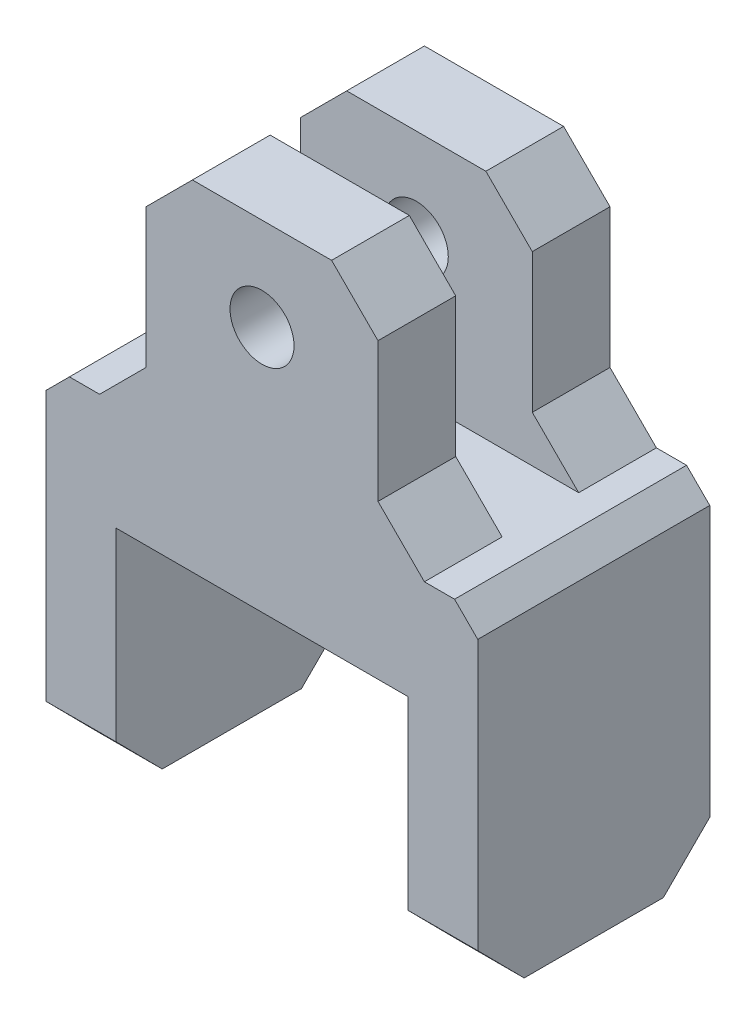
ISO-10303-21;
HEADER;
FILE_DESCRIPTION(('STEP AP214'),'2;1');
FILE_NAME('part.step','',(''),(''),'','','');
FILE_SCHEMA(('AUTOMOTIVE_DESIGN { 1 0 10303 214 1 1 1 1 }'));
ENDSEC;
DATA;
#1=APPLICATION_CONTEXT('core data for automotive mechanical design processes');
#2=APPLICATION_PROTOCOL_DEFINITION('international standard','automotive_design',2000,#1);
#3=PRODUCT_CONTEXT('',#1,'mechanical');
#4=PRODUCT('Part','Part','',(#3));
#5=PRODUCT_RELATED_PRODUCT_CATEGORY('part','',(#4));
#6=PRODUCT_DEFINITION_FORMATION('','',#4);
#7=PRODUCT_DEFINITION_CONTEXT('part definition',#1,'design');
#8=PRODUCT_DEFINITION('design','',#6,#7);
#9=PRODUCT_DEFINITION_SHAPE('','',#8);
#10=(LENGTH_UNIT() NAMED_UNIT(*) SI_UNIT(.MILLI.,.METRE.));
#11=(NAMED_UNIT(*) PLANE_ANGLE_UNIT() SI_UNIT($,.RADIAN.));
#12=(NAMED_UNIT(*) SI_UNIT($,.STERADIAN.) SOLID_ANGLE_UNIT());
#13=UNCERTAINTY_MEASURE_WITH_UNIT(LENGTH_MEASURE(1.E-05),#10,'distance_accuracy_value','');
#14=(GEOMETRIC_REPRESENTATION_CONTEXT(3) GLOBAL_UNCERTAINTY_ASSIGNED_CONTEXT((#13)) GLOBAL_UNIT_ASSIGNED_CONTEXT((#10,
#11,#12)) REPRESENTATION_CONTEXT('',''));
#15=CARTESIAN_POINT('',(0.,0.,0.));
#16=DIRECTION('',(0.,0.,1.));
#17=DIRECTION('',(1.,0.,0.));
#18=AXIS2_PLACEMENT_3D('',#15,#16,#17);
#19=CARTESIAN_POINT('',(29.7555123944606,17.0290580927646,-5.));
#20=DIRECTION('',(-0.707106781186548,0.707106781186548,0.));
#21=DIRECTION('',(-0.707106781186548,-0.707106781186548,0.));
#22=AXIS2_PLACEMENT_3D('',#19,#20,#21);
#23=PLANE('',#22);
#24=DIRECTION('',(0.707106781186548,0.707106781186548,0.));
#25=VECTOR('',#24,1.);
#26=CARTESIAN_POINT('',(29.7555123944606,17.0290580927646,1.65));
#27=LINE('',#26,#25);
#28=CARTESIAN_POINT('',(27.7555120666351,15.0290561351244,1.65));
#29=VERTEX_POINT('',#28);
#30=CARTESIAN_POINT('',(29.7555123944606,17.0290580927646,1.65));
#31=VERTEX_POINT('',#30);
#32=EDGE_CURVE('E447',#29,#31,#27,.T.);
#33=ORIENTED_EDGE('',*,*,#32,.F.);
#34=DIRECTION('',(0.,0.,1.));
#35=VECTOR('',#34,1.);
#36=CARTESIAN_POINT('',(27.7555120666351,15.0290577649391,-5.));
#37=LINE('',#36,#35);
#38=CARTESIAN_POINT('',(27.7555120666351,15.0290577649391,5.));
#39=VERTEX_POINT('',#38);
#40=EDGE_CURVE('E252',#29,#39,#37,.T.);
#41=ORIENTED_EDGE('',*,*,#40,.T.);
#42=DIRECTION('',(-0.707106781186548,-0.707106781186548,0.));
#43=VECTOR('',#42,1.);
#44=CARTESIAN_POINT('',(29.7555123944606,17.0290580927646,5.));
#45=LINE('',#44,#43);
#46=CARTESIAN_POINT('',(29.7555123944606,17.0290580927646,5.));
#47=VERTEX_POINT('',#46);
#48=EDGE_CURVE('E414',#47,#39,#45,.T.);
#49=ORIENTED_EDGE('',*,*,#48,.F.);
#50=DIRECTION('',(0.,0.,1.));
#51=VECTOR('',#50,1.);
#52=CARTESIAN_POINT('',(29.7555123944606,17.0290580927646,-5.));
#53=LINE('',#52,#51);
#54=EDGE_CURVE('E264',#31,#47,#53,.T.);
#55=ORIENTED_EDGE('',*,*,#54,.F.);
#56=EDGE_LOOP('',(#33,#41,#49,#55));
#57=FACE_BOUND('',#56,.T.);
#58=ADVANCED_FACE('F33',(#57),#23,.T.);
#59=CARTESIAN_POINT('',(29.7555123944606,17.0290580927646,-5.));
#60=DIRECTION('',(-1.,0.,0.));
#61=DIRECTION('',(0.,0.,1.));
#62=AXIS2_PLACEMENT_3D('',#59,#60,#61);
#63=PLANE('',#62);
#64=DIRECTION('',(0.,1.,0.));
#65=VECTOR('',#64,1.);
#66=CARTESIAN_POINT('',(29.7555123944606,17.0290580927646,1.65));
#67=LINE('',#66,#65);
#68=CARTESIAN_POINT('',(29.7555123944606,23.0290590762412,1.65));
#69=VERTEX_POINT('',#68);
#70=EDGE_CURVE('E450',#31,#69,#67,.T.);
#71=ORIENTED_EDGE('',*,*,#70,.F.);
#72=ORIENTED_EDGE('',*,*,#54,.T.);
#73=DIRECTION('',(0.,-1.,0.));
#74=VECTOR('',#73,1.);
#75=CARTESIAN_POINT('',(29.7555123944606,17.0290580927646,5.));
#76=LINE('',#75,#74);
#77=CARTESIAN_POINT('',(29.7555123944606,23.0290590762412,5.));
#78=VERTEX_POINT('',#77);
#79=EDGE_CURVE('E368',#78,#47,#76,.T.);
#80=ORIENTED_EDGE('',*,*,#79,.F.);
#81=DIRECTION('',(0.,0.,1.));
#82=VECTOR('',#81,1.);
#83=CARTESIAN_POINT('',(29.7555123944606,23.0290590762412,-5.));
#84=LINE('',#83,#82);
#85=EDGE_CURVE('E274',#69,#78,#84,.T.);
#86=ORIENTED_EDGE('',*,*,#85,.F.);
#87=EDGE_LOOP('',(#71,#72,#80,#86));
#88=FACE_BOUND('',#87,.T.);
#89=ADVANCED_FACE('F501',(#88),#63,.T.);
#90=CARTESIAN_POINT('',(29.7555123944606,23.0290590762412,-5.));
#91=DIRECTION('',(-0.707106534232211,0.707107028140798,0.));
#92=DIRECTION('',(-0.707107028140798,-0.707106534232211,0.));
#93=AXIS2_PLACEMENT_3D('',#90,#91,#92);
#94=PLANE('',#93);
#95=DIRECTION('',(0.707107028140798,0.707106534232211,0.));
#96=VECTOR('',#95,1.);
#97=CARTESIAN_POINT('',(29.7555123944606,23.0290590762412,1.65));
#98=LINE('',#97,#96);
#99=CARTESIAN_POINT('',(31.7555122566249,25.0290575414216,1.65));
#100=VERTEX_POINT('',#99);
#101=EDGE_CURVE('E452',#69,#100,#98,.T.);
#102=ORIENTED_EDGE('',*,*,#101,.F.);
#103=ORIENTED_EDGE('',*,*,#85,.T.);
#104=DIRECTION('',(-0.707107028140798,-0.707106534232211,0.));
#105=VECTOR('',#104,1.);
#106=CARTESIAN_POINT('',(29.7555123944606,23.0290590762412,5.));
#107=LINE('',#106,#105);
#108=CARTESIAN_POINT('',(31.7555122566249,25.0290575414216,5.));
#109=VERTEX_POINT('',#108);
#110=EDGE_CURVE('E365',#109,#78,#107,.T.);
#111=ORIENTED_EDGE('',*,*,#110,.F.);
#112=DIRECTION('',(0.,0.,1.));
#113=VECTOR('',#112,1.);
#114=CARTESIAN_POINT('',(31.7555122566249,25.0290575414216,-5.));
#115=LINE('',#114,#113);
#116=EDGE_CURVE('E278',#100,#109,#115,.T.);
#117=ORIENTED_EDGE('',*,*,#116,.F.);
#118=EDGE_LOOP('',(#102,#103,#111,#117));
#119=FACE_BOUND('',#118,.T.);
#120=ADVANCED_FACE('F505',(#119),#94,.T.);
#121=CARTESIAN_POINT('',(31.7555122566249,25.0290575414216,-5.));
#122=DIRECTION('',(0.,1.,0.));
#123=DIRECTION('',(0.,0.,1.));
#124=AXIS2_PLACEMENT_3D('',#121,#122,#123);
#125=PLANE('',#124);
#126=DIRECTION('',(1.,0.,0.));
#127=VECTOR('',#126,1.);
#128=CARTESIAN_POINT('',(25.4555122484293,25.0290575414216,1.65));
#129=LINE('',#128,#127);
#130=CARTESIAN_POINT('',(37.7555118431177,25.0290575414216,1.65));
#131=VERTEX_POINT('',#130);
#132=EDGE_CURVE('E471',#100,#131,#129,.T.);
#133=ORIENTED_EDGE('',*,*,#132,.F.);
#134=ORIENTED_EDGE('',*,*,#116,.T.);
#135=DIRECTION('',(-1.,0.,0.));
#136=VECTOR('',#135,1.);
#137=CARTESIAN_POINT('',(31.7555122566249,25.0290575414216,5.));
#138=LINE('',#137,#136);
#139=CARTESIAN_POINT('',(37.7555118431177,25.0290575414216,5.));
#140=VERTEX_POINT('',#139);
#141=EDGE_CURVE('E362',#140,#109,#138,.T.);
#142=ORIENTED_EDGE('',*,*,#141,.F.);
#143=DIRECTION('',(0.,0.,1.));
#144=VECTOR('',#143,1.);
#145=CARTESIAN_POINT('',(37.7555118431177,25.0290575414216,-5.));
#146=LINE('',#145,#144);
#147=EDGE_CURVE('E282',#131,#140,#146,.T.);
#148=ORIENTED_EDGE('',*,*,#147,.F.);
#149=EDGE_LOOP('',(#133,#134,#142,#148));
#150=FACE_BOUND('',#149,.T.);
#151=ADVANCED_FACE('F553',(#150),#125,.T.);
#152=CARTESIAN_POINT('',(37.7555118431177,25.0290575414216,-5.));
#153=DIRECTION('',(0.707107028140798,0.707106534232211,0.));
#154=DIRECTION('',(-0.707106534232211,0.707107028140798,0.));
#155=AXIS2_PLACEMENT_3D('',#152,#153,#154);
#156=PLANE('',#155);
#157=DIRECTION('',(0.707106534232211,-0.707107028140798,0.));
#158=VECTOR('',#157,1.);
#159=CARTESIAN_POINT('',(37.7555118431177,25.0290575414216,1.65));
#160=LINE('',#159,#158);
#161=CARTESIAN_POINT('',(39.7555105411287,23.0290574464266,1.65));
#162=VERTEX_POINT('',#161);
#163=EDGE_CURVE('E454',#131,#162,#160,.T.);
#164=ORIENTED_EDGE('',*,*,#163,.F.);
#165=ORIENTED_EDGE('',*,*,#147,.T.);
#166=DIRECTION('',(-0.707106534232211,0.707107028140798,0.));
#167=VECTOR('',#166,1.);
#168=CARTESIAN_POINT('',(37.7555118431177,25.0290575414216,5.));
#169=LINE('',#168,#167);
#170=CARTESIAN_POINT('',(39.7555105411287,23.0290574464266,5.));
#171=VERTEX_POINT('',#170);
#172=EDGE_CURVE('E359',#171,#140,#169,.T.);
#173=ORIENTED_EDGE('',*,*,#172,.F.);
#174=DIRECTION('',(0.,0.,1.));
#175=VECTOR('',#174,1.);
#176=CARTESIAN_POINT('',(39.7555105411287,23.0290574464266,-5.));
#177=LINE('',#176,#175);
#178=EDGE_CURVE('E286',#162,#171,#177,.T.);
#179=ORIENTED_EDGE('',*,*,#178,.F.);
#180=EDGE_LOOP('',(#164,#165,#173,#179));
#181=FACE_BOUND('',#180,.T.);
#182=ADVANCED_FACE('F523',(#181),#156,.T.);
#183=CARTESIAN_POINT('',(39.7555105411287,23.0290574464266,-5.));
#184=DIRECTION('',(1.,0.,0.));
#185=DIRECTION('',(0.,0.,-1.));
#186=AXIS2_PLACEMENT_3D('',#183,#184,#185);
#187=PLANE('',#186);
#188=DIRECTION('',(0.,-1.,0.));
#189=VECTOR('',#188,1.);
#190=CARTESIAN_POINT('',(39.7555105411287,23.0290574464266,1.65));
#191=LINE('',#190,#189);
#192=CARTESIAN_POINT('',(39.7555105411287,17.0290564629499,1.65));
#193=VERTEX_POINT('',#192);
#194=EDGE_CURVE('E456',#162,#193,#191,.T.);
#195=ORIENTED_EDGE('',*,*,#194,.F.);
#196=ORIENTED_EDGE('',*,*,#178,.T.);
#197=DIRECTION('',(0.,1.,0.));
#198=VECTOR('',#197,1.);
#199=CARTESIAN_POINT('',(39.7555105411287,23.0290574464266,5.));
#200=LINE('',#199,#198);
#201=CARTESIAN_POINT('',(39.7555105411287,17.0290564629499,5.));
#202=VERTEX_POINT('',#201);
#203=EDGE_CURVE('E356',#202,#171,#200,.T.);
#204=ORIENTED_EDGE('',*,*,#203,.F.);
#205=DIRECTION('',(0.,0.,1.));
#206=VECTOR('',#205,1.);
#207=CARTESIAN_POINT('',(39.7555105411287,17.0290564629499,-5.));
#208=LINE('',#207,#206);
#209=EDGE_CURVE('E290',#193,#202,#208,.T.);
#210=ORIENTED_EDGE('',*,*,#209,.F.);
#211=EDGE_LOOP('',(#195,#196,#204,#210));
#212=FACE_BOUND('',#211,.T.);
#213=ADVANCED_FACE('F516',(#212),#187,.T.);
#214=CARTESIAN_POINT('',(41.7555108689543,15.0290561351244,-5.));
#215=DIRECTION('',(0.707106781186548,0.707106781186548,0.));
#216=DIRECTION('',(-0.707106781186548,0.707106781186548,0.));
#217=AXIS2_PLACEMENT_3D('',#214,#215,#216);
#218=PLANE('',#217);
#219=DIRECTION('',(0.707106781186548,-0.707106781186548,0.));
#220=VECTOR('',#219,1.);
#221=CARTESIAN_POINT('',(41.7555108689543,15.0290561351244,1.65));
#222=LINE('',#221,#220);
#223=CARTESIAN_POINT('',(41.7555108689543,15.0290561351244,1.65));
#224=VERTEX_POINT('',#223);
#225=EDGE_CURVE('E235',#193,#224,#222,.T.);
#226=ORIENTED_EDGE('',*,*,#225,.F.);
#227=ORIENTED_EDGE('',*,*,#209,.T.);
#228=DIRECTION('',(-0.707106781186548,0.707106781186548,0.));
#229=VECTOR('',#228,1.);
#230=CARTESIAN_POINT('',(41.7555108689543,15.0290561351244,5.));
#231=LINE('',#230,#229);
#232=CARTESIAN_POINT('',(41.7555108689543,15.0290561351244,5.));
#233=VERTEX_POINT('',#232);
#234=EDGE_CURVE('E353',#233,#202,#231,.T.);
#235=ORIENTED_EDGE('',*,*,#234,.F.);
#236=DIRECTION('',(0.,0.,1.));
#237=VECTOR('',#236,1.);
#238=CARTESIAN_POINT('',(41.7555108689543,15.0290561351244,-5.));
#239=LINE('',#238,#237);
#240=EDGE_CURVE('E292',#224,#233,#239,.T.);
#241=ORIENTED_EDGE('',*,*,#240,.F.);
#242=EDGE_LOOP('',(#226,#227,#235,#241));
#243=FACE_BOUND('',#242,.T.);
#244=ADVANCED_FACE('F510',(#243),#218,.T.);
#245=DIRECTION('',(-0.707106781186548,-0.707106781186548,0.));
#246=VECTOR('',#245,1.);
#247=CARTESIAN_POINT('',(29.7555123944606,17.0290580927646,-1.65));
#248=LINE('',#247,#246);
#249=CARTESIAN_POINT('',(29.7555123944606,17.0290580927646,-1.65));
#250=VERTEX_POINT('',#249);
#251=CARTESIAN_POINT('',(27.7555120666351,15.0290561351244,-1.65));
#252=VERTEX_POINT('',#251);
#253=EDGE_CURVE('E228',#250,#252,#248,.T.);
#254=ORIENTED_EDGE('',*,*,#253,.F.);
#255=CARTESIAN_POINT('',(29.7555123944606,17.0290580927646,-5.));
#256=VERTEX_POINT('',#255);
#257=EDGE_CURVE('E260',#256,#250,#53,.T.);
#258=ORIENTED_EDGE('',*,*,#257,.F.);
#259=DIRECTION('',(-0.707106781186548,-0.707106781186548,0.));
#260=VECTOR('',#259,1.);
#261=CARTESIAN_POINT('',(29.7555123944606,17.0290580927646,-5.));
#262=LINE('',#261,#260);
#263=CARTESIAN_POINT('',(27.7555120666351,15.0290577649391,-5.));
#264=VERTEX_POINT('',#263);
#265=EDGE_CURVE('E250',#256,#264,#262,.T.);
#266=ORIENTED_EDGE('',*,*,#265,.T.);
#267=EDGE_CURVE('E241',#264,#252,#37,.T.);
#268=ORIENTED_EDGE('',*,*,#267,.T.);
#269=EDGE_LOOP('',(#254,#258,#266,#268));
#270=FACE_BOUND('',#269,.T.);
#271=ADVANCED_FACE('F35',(#270),#23,.T.);
#272=DIRECTION('',(0.,-1.,0.));
#273=VECTOR('',#272,1.);
#274=CARTESIAN_POINT('',(29.7555123944606,17.0290580927646,-1.65));
#275=LINE('',#274,#273);
#276=CARTESIAN_POINT('',(29.7555123944606,23.0290590762412,-1.65));
#277=VERTEX_POINT('',#276);
#278=EDGE_CURVE('E231',#277,#250,#275,.T.);
#279=ORIENTED_EDGE('',*,*,#278,.F.);
#280=CARTESIAN_POINT('',(29.7555123944606,23.0290590762412,-5.));
#281=VERTEX_POINT('',#280);
#282=EDGE_CURVE('E268',#281,#277,#84,.T.);
#283=ORIENTED_EDGE('',*,*,#282,.F.);
#284=DIRECTION('',(0.,-1.,0.));
#285=VECTOR('',#284,1.);
#286=CARTESIAN_POINT('',(29.7555123944606,17.0290580927646,-5.));
#287=LINE('',#286,#285);
#288=EDGE_CURVE('E256',#281,#256,#287,.T.);
#289=ORIENTED_EDGE('',*,*,#288,.T.);
#290=ORIENTED_EDGE('',*,*,#257,.T.);
#291=EDGE_LOOP('',(#279,#283,#289,#290));
#292=FACE_BOUND('',#291,.T.);
#293=ADVANCED_FACE('F408',(#292),#63,.T.);
#294=DIRECTION('',(-0.707107028140798,-0.707106534232211,0.));
#295=VECTOR('',#294,1.);
#296=CARTESIAN_POINT('',(29.7555123944606,23.0290590762412,-1.65));
#297=LINE('',#296,#295);
#298=CARTESIAN_POINT('',(31.7555122566249,25.0290575414216,-1.65));
#299=VERTEX_POINT('',#298);
#300=EDGE_CURVE('E460',#299,#277,#297,.T.);
#301=ORIENTED_EDGE('',*,*,#300,.F.);
#302=CARTESIAN_POINT('',(31.7555122566249,25.0290575414216,-5.));
#303=VERTEX_POINT('',#302);
#304=EDGE_CURVE('E275',#303,#299,#115,.T.);
#305=ORIENTED_EDGE('',*,*,#304,.F.);
#306=DIRECTION('',(-0.707107028140798,-0.707106534232211,0.));
#307=VECTOR('',#306,1.);
#308=CARTESIAN_POINT('',(29.7555123944606,23.0290590762412,-5.));
#309=LINE('',#308,#307);
#310=EDGE_CURVE('E403',#303,#281,#309,.T.);
#311=ORIENTED_EDGE('',*,*,#310,.T.);
#312=ORIENTED_EDGE('',*,*,#282,.T.);
#313=EDGE_LOOP('',(#301,#305,#311,#312));
#314=FACE_BOUND('',#313,.T.);
#315=ADVANCED_FACE('F515',(#314),#94,.T.);
#316=DIRECTION('',(1.,0.,0.));
#317=VECTOR('',#316,1.);
#318=CARTESIAN_POINT('',(25.4555122484293,25.0290575414216,-1.65));
#319=LINE('',#318,#317);
#320=CARTESIAN_POINT('',(37.7555118431177,25.0290575414216,-1.65));
#321=VERTEX_POINT('',#320);
#322=EDGE_CURVE('E245',#299,#321,#319,.T.);
#323=ORIENTED_EDGE('',*,*,#322,.T.);
#324=CARTESIAN_POINT('',(37.7555118431177,25.0290575414216,-5.));
#325=VERTEX_POINT('',#324);
#326=EDGE_CURVE('E279',#325,#321,#146,.T.);
#327=ORIENTED_EDGE('',*,*,#326,.F.);
#328=DIRECTION('',(-1.,0.,0.));
#329=VECTOR('',#328,1.);
#330=CARTESIAN_POINT('',(31.7555122566249,25.0290575414216,-5.));
#331=LINE('',#330,#329);
#332=EDGE_CURVE('E401',#325,#303,#331,.T.);
#333=ORIENTED_EDGE('',*,*,#332,.T.);
#334=ORIENTED_EDGE('',*,*,#304,.T.);
#335=EDGE_LOOP('',(#323,#327,#333,#334));
#336=FACE_BOUND('',#335,.T.);
#337=ADVANCED_FACE('F545',(#336),#125,.T.);
#338=DIRECTION('',(-0.707106534232211,0.707107028140798,0.));
#339=VECTOR('',#338,1.);
#340=CARTESIAN_POINT('',(37.7555118431177,25.0290575414216,-1.65));
#341=LINE('',#340,#339);
#342=CARTESIAN_POINT('',(39.7555105411287,23.0290574464266,-1.65));
#343=VERTEX_POINT('',#342);
#344=EDGE_CURVE('E462',#343,#321,#341,.T.);
#345=ORIENTED_EDGE('',*,*,#344,.F.);
#346=CARTESIAN_POINT('',(39.7555105411287,23.0290574464266,-5.));
#347=VERTEX_POINT('',#346);
#348=EDGE_CURVE('E283',#347,#343,#177,.T.);
#349=ORIENTED_EDGE('',*,*,#348,.F.);
#350=DIRECTION('',(-0.707106534232211,0.707107028140798,0.));
#351=VECTOR('',#350,1.);
#352=CARTESIAN_POINT('',(37.7555118431177,25.0290575414216,-5.));
#353=LINE('',#352,#351);
#354=EDGE_CURVE('E398',#347,#325,#353,.T.);
#355=ORIENTED_EDGE('',*,*,#354,.T.);
#356=ORIENTED_EDGE('',*,*,#326,.T.);
#357=EDGE_LOOP('',(#345,#349,#355,#356));
#358=FACE_BOUND('',#357,.T.);
#359=ADVANCED_FACE('F536',(#358),#156,.T.);
#360=DIRECTION('',(0.,1.,0.));
#361=VECTOR('',#360,1.);
#362=CARTESIAN_POINT('',(39.7555105411287,23.0290574464266,-1.65));
#363=LINE('',#362,#361);
#364=CARTESIAN_POINT('',(39.7555105411287,17.0290564629499,-1.65));
#365=VERTEX_POINT('',#364);
#366=EDGE_CURVE('E464',#365,#343,#363,.T.);
#367=ORIENTED_EDGE('',*,*,#366,.F.);
#368=CARTESIAN_POINT('',(39.7555105411287,17.0290564629499,-5.));
#369=VERTEX_POINT('',#368);
#370=EDGE_CURVE('E287',#369,#365,#208,.T.);
#371=ORIENTED_EDGE('',*,*,#370,.F.);
#372=DIRECTION('',(0.,1.,0.));
#373=VECTOR('',#372,1.);
#374=CARTESIAN_POINT('',(39.7555105411287,23.0290574464266,-5.));
#375=LINE('',#374,#373);
#376=EDGE_CURVE('E395',#369,#347,#375,.T.);
#377=ORIENTED_EDGE('',*,*,#376,.T.);
#378=ORIENTED_EDGE('',*,*,#348,.T.);
#379=EDGE_LOOP('',(#367,#371,#377,#378));
#380=FACE_BOUND('',#379,.T.);
#381=ADVANCED_FACE('F526',(#380),#187,.T.);
#382=DIRECTION('',(-0.707106781186548,0.707106781186548,0.));
#383=VECTOR('',#382,1.);
#384=CARTESIAN_POINT('',(41.7555108689543,15.0290561351244,-1.65));
#385=LINE('',#384,#383);
#386=CARTESIAN_POINT('',(41.7555108689543,15.0290561351244,-1.65));
#387=VERTEX_POINT('',#386);
#388=EDGE_CURVE('E466',#387,#365,#385,.T.);
#389=ORIENTED_EDGE('',*,*,#388,.F.);
#390=CARTESIAN_POINT('',(41.7555108689543,15.0290561351244,-5.));
#391=VERTEX_POINT('',#390);
#392=EDGE_CURVE('E244',#391,#387,#239,.T.);
#393=ORIENTED_EDGE('',*,*,#392,.F.);
#394=DIRECTION('',(-0.707106781186548,0.707106781186548,0.));
#395=VECTOR('',#394,1.);
#396=CARTESIAN_POINT('',(41.7555108689543,15.0290561351244,-5.));
#397=LINE('',#396,#395);
#398=EDGE_CURVE('E392',#391,#369,#397,.T.);
#399=ORIENTED_EDGE('',*,*,#398,.T.);
#400=ORIENTED_EDGE('',*,*,#370,.T.);
#401=EDGE_LOOP('',(#389,#393,#399,#400));
#402=FACE_BOUND('',#401,.T.);
#403=ADVANCED_FACE('F519',(#402),#218,.T.);
#404=CARTESIAN_POINT('',(43.0555105232473,15.0290561351244,-5.));
#405=DIRECTION('',(0.,1.,0.));
#406=DIRECTION('',(-1.,0.,0.));
#407=AXIS2_PLACEMENT_3D('',#404,#405,#406);
#408=PLANE('',#407);
#409=ORIENTED_EDGE('',*,*,#392,.T.);
#410=DIRECTION('',(1.,0.,0.));
#411=VECTOR('',#410,1.);
#412=CARTESIAN_POINT('',(25.4555122484293,15.0290561351244,-1.65));
#413=LINE('',#412,#411);
#414=EDGE_CURVE('E49',#252,#387,#413,.T.);
#415=ORIENTED_EDGE('',*,*,#414,.F.);
#416=ORIENTED_EDGE('',*,*,#267,.F.);
#417=DIRECTION('',(-1.,0.,0.));
#418=VECTOR('',#417,1.);
#419=CARTESIAN_POINT('',(27.7555120666351,15.0290577649391,-5.));
#420=LINE('',#419,#418);
#421=CARTESIAN_POINT('',(26.455512412342,15.0290577649391,-5.));
#422=VERTEX_POINT('',#421);
#423=EDGE_CURVE('E372',#264,#422,#420,.T.);
#424=ORIENTED_EDGE('',*,*,#423,.T.);
#425=DIRECTION('',(0.,0.,1.));
#426=VECTOR('',#425,1.);
#427=CARTESIAN_POINT('',(26.455512412342,15.0290577649391,-5.));
#428=LINE('',#427,#426);
#429=CARTESIAN_POINT('',(26.455512412342,15.0290577649391,5.));
#430=VERTEX_POINT('',#429);
#431=EDGE_CURVE('E251',#422,#430,#428,.T.);
#432=ORIENTED_EDGE('',*,*,#431,.T.);
#433=DIRECTION('',(-1.,0.,0.));
#434=VECTOR('',#433,1.);
#435=CARTESIAN_POINT('',(27.7555120666351,15.0290577649391,5.));
#436=LINE('',#435,#434);
#437=EDGE_CURVE('E329',#39,#430,#436,.T.);
#438=ORIENTED_EDGE('',*,*,#437,.F.);
#439=ORIENTED_EDGE('',*,*,#40,.F.);
#440=DIRECTION('',(1.,0.,0.));
#441=VECTOR('',#440,1.);
#442=CARTESIAN_POINT('',(25.4555122484293,15.0290561351244,1.65));
#443=LINE('',#442,#441);
#444=EDGE_CURVE('E467',#29,#224,#443,.T.);
#445=ORIENTED_EDGE('',*,*,#444,.T.);
#446=ORIENTED_EDGE('',*,*,#240,.T.);
#447=DIRECTION('',(-1.,0.,0.));
#448=VECTOR('',#447,1.);
#449=CARTESIAN_POINT('',(43.0555105232473,15.0290561351244,5.));
#450=LINE('',#449,#448);
#451=CARTESIAN_POINT('',(43.0555105232473,15.0290561351244,5.));
#452=VERTEX_POINT('',#451);
#453=EDGE_CURVE('E350',#452,#233,#450,.T.);
#454=ORIENTED_EDGE('',*,*,#453,.F.);
#455=DIRECTION('',(0.,0.,1.));
#456=VECTOR('',#455,1.);
#457=CARTESIAN_POINT('',(43.0555105232473,15.0290561351244,-5.));
#458=LINE('',#457,#456);
#459=CARTESIAN_POINT('',(43.0555105232473,15.0290561351244,-5.));
#460=VERTEX_POINT('',#459);
#461=EDGE_CURVE('E293',#460,#452,#458,.T.);
#462=ORIENTED_EDGE('',*,*,#461,.F.);
#463=DIRECTION('',(-1.,0.,0.));
#464=VECTOR('',#463,1.);
#465=CARTESIAN_POINT('',(43.0555105232473,15.0290561351244,-5.));
#466=LINE('',#465,#464);
#467=EDGE_CURVE('E390',#460,#391,#466,.T.);
#468=ORIENTED_EDGE('',*,*,#467,.T.);
#469=EDGE_LOOP('',(#409,#415,#416,#424,#432,#438,#439,#445,#446,#454,#462,#468));
#470=FACE_BOUND('',#469,.T.);
#471=ADVANCED_FACE('F239',(#470),#408,.T.);
#472=CARTESIAN_POINT('',(44.0555106871601,14.0290559712116,-5.));
#473=DIRECTION('',(0.707106781186548,0.707106781186548,0.));
#474=DIRECTION('',(-0.707106781186548,0.707106781186548,0.));
#475=AXIS2_PLACEMENT_3D('',#472,#473,#474);
#476=PLANE('',#475);
#477=ORIENTED_EDGE('',*,*,#461,.T.);
#478=DIRECTION('',(-0.707106781186548,0.707106781186548,0.));
#479=VECTOR('',#478,1.);
#480=CARTESIAN_POINT('',(44.0555106871601,14.0290559712116,5.));
#481=LINE('',#480,#479);
#482=CARTESIAN_POINT('',(44.0555106871601,14.0290559712116,5.));
#483=VERTEX_POINT('',#482);
#484=EDGE_CURVE('E347',#483,#452,#481,.T.);
#485=ORIENTED_EDGE('',*,*,#484,.F.);
#486=DIRECTION('',(0.,0.,1.));
#487=VECTOR('',#486,1.);
#488=CARTESIAN_POINT('',(44.0555106871601,14.0290559712116,-5.));
#489=LINE('',#488,#487);
#490=CARTESIAN_POINT('',(44.0555106871601,14.0290559712116,-5.));
#491=VERTEX_POINT('',#490);
#492=EDGE_CURVE('E295',#491,#483,#489,.T.);
#493=ORIENTED_EDGE('',*,*,#492,.F.);
#494=DIRECTION('',(-0.707106781186548,0.707106781186548,0.));
#495=VECTOR('',#494,1.);
#496=CARTESIAN_POINT('',(44.0555106871601,14.0290559712116,-5.));
#497=LINE('',#496,#495);
#498=EDGE_CURVE('E387',#491,#460,#497,.T.);
#499=ORIENTED_EDGE('',*,*,#498,.T.);
#500=EDGE_LOOP('',(#477,#485,#493,#499));
#501=FACE_BOUND('',#500,.T.);
#502=ADVANCED_FACE('F535',(#501),#476,.T.);
#503=CARTESIAN_POINT('',(44.0555106871601,0.389058047465075,-5.));
#504=DIRECTION('',(1.,0.,0.));
#505=DIRECTION('',(0.,0.,-1.));
#506=AXIS2_PLACEMENT_3D('',#503,#504,#505);
#507=PLANE('',#506);
#508=DIRECTION('',(0.,-0.707106781186548,0.707106781186548));
#509=VECTOR('',#508,1.);
#510=CARTESIAN_POINT('',(44.0555106871601,2.38905804746507,-5.));
#511=LINE('',#510,#509);
#512=CARTESIAN_POINT('',(44.0555106871601,2.38905804746507,-5.));
#513=VERTEX_POINT('',#512);
#514=CARTESIAN_POINT('',(44.0555106871601,0.389058047465075,-3.));
#515=VERTEX_POINT('',#514);
#516=EDGE_CURVE('E445',#513,#515,#511,.T.);
#517=ORIENTED_EDGE('',*,*,#516,.F.);
#518=DIRECTION('',(0.,1.,0.));
#519=VECTOR('',#518,1.);
#520=CARTESIAN_POINT('',(44.0555106871601,0.389058047465075,-5.));
#521=LINE('',#520,#519);
#522=EDGE_CURVE('E385',#513,#491,#521,.T.);
#523=ORIENTED_EDGE('',*,*,#522,.T.);
#524=ORIENTED_EDGE('',*,*,#492,.T.);
#525=DIRECTION('',(0.,1.,0.));
#526=VECTOR('',#525,1.);
#527=CARTESIAN_POINT('',(44.0555106871601,0.389058047465075,5.));
#528=LINE('',#527,#526);
#529=CARTESIAN_POINT('',(44.0555106871601,2.41080829765876,5.));
#530=VERTEX_POINT('',#529);
#531=EDGE_CURVE('E345',#530,#483,#528,.T.);
#532=ORIENTED_EDGE('',*,*,#531,.F.);
#533=DIRECTION('',(0.,0.710920528041965,0.70327235322351));
#534=VECTOR('',#533,1.);
#535=CARTESIAN_POINT('',(44.0555106871601,2.41080829765876,5.));
#536=LINE('',#535,#534);
#537=CARTESIAN_POINT('',(44.0555106871601,0.389058047465075,3.));
#538=VERTEX_POINT('',#537);
#539=EDGE_CURVE('E432',#538,#530,#536,.T.);
#540=ORIENTED_EDGE('',*,*,#539,.F.);
#541=DIRECTION('',(0.,0.,1.));
#542=VECTOR('',#541,1.);
#543=CARTESIAN_POINT('',(44.0555106871601,0.389058047465075,-5.));
#544=LINE('',#543,#542);
#545=EDGE_CURVE('E298',#515,#538,#544,.T.);
#546=ORIENTED_EDGE('',*,*,#545,.F.);
#547=EDGE_LOOP('',(#517,#523,#524,#532,#540,#546));
#548=FACE_BOUND('',#547,.T.);
#549=ADVANCED_FACE('F614',(#548),#507,.T.);
#550=CARTESIAN_POINT('',(41.0555118252363,0.389058047465075,-5.));
#551=DIRECTION('',(0.,-1.,0.));
#552=DIRECTION('',(0.,0.,-1.));
#553=AXIS2_PLACEMENT_3D('',#550,#551,#552);
#554=PLANE('',#553);
#555=DIRECTION('',(1.,0.,0.));
#556=VECTOR('',#555,1.);
#557=CARTESIAN_POINT('',(25.4555122484293,0.389058047465075,-3.));
#558=LINE('',#557,#556);
#559=CARTESIAN_POINT('',(41.0555118252363,0.389058047465075,-3.));
#560=VERTEX_POINT('',#559);
#561=EDGE_CURVE('E442',#560,#515,#558,.T.);
#562=ORIENTED_EDGE('',*,*,#561,.T.);
#563=ORIENTED_EDGE('',*,*,#545,.T.);
#564=DIRECTION('',(1.,0.,0.));
#565=VECTOR('',#564,1.);
#566=CARTESIAN_POINT('',(25.4555122484293,0.389058047465075,3.));
#567=LINE('',#566,#565);
#568=CARTESIAN_POINT('',(41.0555118252363,0.389058047465075,3.));
#569=VERTEX_POINT('',#568);
#570=EDGE_CURVE('E430',#569,#538,#567,.T.);
#571=ORIENTED_EDGE('',*,*,#570,.F.);
#572=DIRECTION('',(0.,0.,1.));
#573=VECTOR('',#572,1.);
#574=CARTESIAN_POINT('',(41.0555118252363,0.389058047465075,-5.));
#575=LINE('',#574,#573);
#576=EDGE_CURVE('E300',#560,#569,#575,.T.);
#577=ORIENTED_EDGE('',*,*,#576,.F.);
#578=EDGE_LOOP('',(#562,#563,#571,#577));
#579=FACE_BOUND('',#578,.T.);
#580=ADVANCED_FACE('F746',(#579),#554,.T.);
#581=CARTESIAN_POINT('',(41.0555118252363,10.3890578239477,-5.));
#582=DIRECTION('',(-1.,0.,0.));
#583=DIRECTION('',(0.,0.,1.));
#584=AXIS2_PLACEMENT_3D('',#581,#582,#583);
#585=PLANE('',#584);
#586=DIRECTION('',(0.,0.707106781186548,-0.707106781186548));
#587=VECTOR('',#586,1.);
#588=CARTESIAN_POINT('',(41.0555118252363,6.38905793570637,-8.99999988824129));
#589=LINE('',#588,#587);
#590=CARTESIAN_POINT('',(41.0555118252363,2.38905804746507,-5.));
#591=VERTEX_POINT('',#590);
#592=EDGE_CURVE('E434',#560,#591,#589,.T.);
#593=ORIENTED_EDGE('',*,*,#592,.F.);
#594=ORIENTED_EDGE('',*,*,#576,.T.);
#595=DIRECTION('',(0.,-0.710920528041965,-0.70327235322351));
#596=VECTOR('',#595,1.);
#597=CARTESIAN_POINT('',(41.0555118252363,1.44337188472446,4.04297139288929));
#598=LINE('',#597,#596);
#599=CARTESIAN_POINT('',(41.0555118252363,2.41080829765876,5.));
#600=VERTEX_POINT('',#599);
#601=EDGE_CURVE('E419',#600,#569,#598,.T.);
#602=ORIENTED_EDGE('',*,*,#601,.F.);
#603=DIRECTION('',(0.,-1.,0.));
#604=VECTOR('',#603,1.);
#605=CARTESIAN_POINT('',(41.0555118252363,10.3890578239477,5.));
#606=LINE('',#605,#604);
#607=CARTESIAN_POINT('',(41.0555118252363,10.3890578239477,5.));
#608=VERTEX_POINT('',#607);
#609=EDGE_CURVE('E343',#608,#600,#606,.T.);
#610=ORIENTED_EDGE('',*,*,#609,.F.);
#611=DIRECTION('',(0.,0.,1.));
#612=VECTOR('',#611,1.);
#613=CARTESIAN_POINT('',(41.0555118252363,10.3890578239477,-5.));
#614=LINE('',#613,#612);
#615=CARTESIAN_POINT('',(41.0555118252363,10.3890578239477,-5.));
#616=VERTEX_POINT('',#615);
#617=EDGE_CURVE('E302',#616,#608,#614,.T.);
#618=ORIENTED_EDGE('',*,*,#617,.F.);
#619=DIRECTION('',(0.,-1.,0.));
#620=VECTOR('',#619,1.);
#621=CARTESIAN_POINT('',(41.0555118252363,10.3890578239477,-5.));
#622=LINE('',#621,#620);
#623=EDGE_CURVE('E382',#616,#591,#622,.T.);
#624=ORIENTED_EDGE('',*,*,#623,.T.);
#625=EDGE_LOOP('',(#593,#594,#602,#610,#618,#624));
#626=FACE_BOUND('',#625,.T.);
#627=ADVANCED_FACE('F709',(#626),#585,.T.);
#628=CARTESIAN_POINT('',(28.4555122745063,10.3890578239477,-5.));
#629=DIRECTION('',(0.,-1.,0.));
#630=DIRECTION('',(0.,0.,-1.));
#631=AXIS2_PLACEMENT_3D('',#628,#629,#630);
#632=PLANE('',#631);
#633=ORIENTED_EDGE('',*,*,#617,.T.);
#634=DIRECTION('',(1.,0.,0.));
#635=VECTOR('',#634,1.);
#636=CARTESIAN_POINT('',(28.4555122745063,10.3890578239477,5.));
#637=LINE('',#636,#635);
#638=CARTESIAN_POINT('',(28.4555122745063,10.3890578239477,5.));
#639=VERTEX_POINT('',#638);
#640=EDGE_CURVE('E337',#639,#608,#637,.T.);
#641=ORIENTED_EDGE('',*,*,#640,.F.);
#642=DIRECTION('',(0.,0.,1.));
#643=VECTOR('',#642,1.);
#644=CARTESIAN_POINT('',(28.4555122745063,10.3890578239477,-5.));
#645=LINE('',#644,#643);
#646=CARTESIAN_POINT('',(28.4555122745063,10.3890578239477,-5.));
#647=VERTEX_POINT('',#646);
#648=EDGE_CURVE('E304',#647,#639,#645,.T.);
#649=ORIENTED_EDGE('',*,*,#648,.F.);
#650=DIRECTION('',(1.,0.,0.));
#651=VECTOR('',#650,1.);
#652=CARTESIAN_POINT('',(28.4555122745063,10.3890578239477,-5.));
#653=LINE('',#652,#651);
#654=EDGE_CURVE('E379',#647,#616,#653,.T.);
#655=ORIENTED_EDGE('',*,*,#654,.T.);
#656=EDGE_LOOP('',(#633,#641,#649,#655));
#657=FACE_BOUND('',#656,.T.);
#658=ADVANCED_FACE('F704',(#657),#632,.T.);
#659=CARTESIAN_POINT('',(28.4555122745063,0.389058047465075,-5.));
#660=DIRECTION('',(1.,0.,0.));
#661=DIRECTION('',(0.,0.,-1.));
#662=AXIS2_PLACEMENT_3D('',#659,#660,#661);
#663=PLANE('',#662);
#664=DIRECTION('',(0.,-0.707106781186548,0.707106781186548));
#665=VECTOR('',#664,1.);
#666=CARTESIAN_POINT('',(28.4555122745063,1.38905804746507,-4.));
#667=LINE('',#666,#665);
#668=CARTESIAN_POINT('',(28.4555122745063,2.38905804746507,-5.));
#669=VERTEX_POINT('',#668);
#670=CARTESIAN_POINT('',(28.4555122745063,0.389058047465075,-3.));
#671=VERTEX_POINT('',#670);
#672=EDGE_CURVE('E437',#669,#671,#667,.T.);
#673=ORIENTED_EDGE('',*,*,#672,.F.);
#674=DIRECTION('',(0.,1.,0.));
#675=VECTOR('',#674,1.);
#676=CARTESIAN_POINT('',(28.4555122745063,0.389058047465075,-5.));
#677=LINE('',#676,#675);
#678=EDGE_CURVE('E377',#669,#647,#677,.T.);
#679=ORIENTED_EDGE('',*,*,#678,.T.);
#680=ORIENTED_EDGE('',*,*,#648,.T.);
#681=DIRECTION('',(0.,1.,0.));
#682=VECTOR('',#681,1.);
#683=CARTESIAN_POINT('',(28.4555122745063,0.389058047465075,5.));
#684=LINE('',#683,#682);
#685=CARTESIAN_POINT('',(28.4555122745063,2.41080829765876,5.));
#686=VERTEX_POINT('',#685);
#687=EDGE_CURVE('E335',#686,#639,#684,.T.);
#688=ORIENTED_EDGE('',*,*,#687,.F.);
#689=DIRECTION('',(0.,0.710920528041965,0.70327235322351));
#690=VECTOR('',#689,1.);
#691=CARTESIAN_POINT('',(28.4555122745063,-3.61070797422271,-0.956736022468268));
#692=LINE('',#691,#690);
#693=CARTESIAN_POINT('',(28.4555122745063,0.389058047465075,3.));
#694=VERTEX_POINT('',#693);
#695=EDGE_CURVE('E422',#694,#686,#692,.T.);
#696=ORIENTED_EDGE('',*,*,#695,.F.);
#697=DIRECTION('',(0.,0.,1.));
#698=VECTOR('',#697,1.);
#699=CARTESIAN_POINT('',(28.4555122745063,0.389058047465075,-5.));
#700=LINE('',#699,#698);
#701=EDGE_CURVE('E307',#671,#694,#700,.T.);
#702=ORIENTED_EDGE('',*,*,#701,.F.);
#703=EDGE_LOOP('',(#673,#679,#680,#688,#696,#702));
#704=FACE_BOUND('',#703,.T.);
#705=ADVANCED_FACE('F708',(#704),#663,.T.);
#706=CARTESIAN_POINT('',(25.4555122484293,0.389058047465075,-5.));
#707=DIRECTION('',(0.,-1.,0.));
#708=DIRECTION('',(0.,0.,-1.));
#709=AXIS2_PLACEMENT_3D('',#706,#707,#708);
#710=PLANE('',#709);
#711=CARTESIAN_POINT('',(25.4555122484293,0.389058047465075,-3.));
#712=VERTEX_POINT('',#711);
#713=EDGE_CURVE('E439',#712,#671,#558,.T.);
#714=ORIENTED_EDGE('',*,*,#713,.T.);
#715=ORIENTED_EDGE('',*,*,#701,.T.);
#716=CARTESIAN_POINT('',(25.4555122484293,0.389058047465075,3.));
#717=VERTEX_POINT('',#716);
#718=EDGE_CURVE('E427',#717,#694,#567,.T.);
#719=ORIENTED_EDGE('',*,*,#718,.F.);
#720=DIRECTION('',(0.,0.,1.));
#721=VECTOR('',#720,1.);
#722=CARTESIAN_POINT('',(25.4555122484293,0.389058047465075,-5.));
#723=LINE('',#722,#721);
#724=EDGE_CURVE('E309',#712,#717,#723,.T.);
#725=ORIENTED_EDGE('',*,*,#724,.F.);
#726=EDGE_LOOP('',(#714,#715,#719,#725));
#727=FACE_BOUND('',#726,.T.);
#728=ADVANCED_FACE('F725',(#727),#710,.T.);
#729=CARTESIAN_POINT('',(25.4555122484293,14.0290576010263,-5.));
#730=DIRECTION('',(-1.,0.,0.));
#731=DIRECTION('',(0.,0.,1.));
#732=AXIS2_PLACEMENT_3D('',#729,#730,#731);
#733=PLANE('',#732);
#734=DIRECTION('',(0.,-0.707106781186548,0.707106781186548));
#735=VECTOR('',#734,1.);
#736=CARTESIAN_POINT('',(25.4555122484293,2.38905804746507,-5.));
#737=LINE('',#736,#735);
#738=CARTESIAN_POINT('',(25.4555122484293,2.38905804746507,-5.));
#739=VERTEX_POINT('',#738);
#740=EDGE_CURVE('E57',#739,#712,#737,.T.);
#741=ORIENTED_EDGE('',*,*,#740,.T.);
#742=ORIENTED_EDGE('',*,*,#724,.T.);
#743=DIRECTION('',(0.,0.710920528041965,0.70327235322351));
#744=VECTOR('',#743,1.);
#745=CARTESIAN_POINT('',(25.4555122484293,2.41080829765876,5.));
#746=LINE('',#745,#744);
#747=CARTESIAN_POINT('',(25.4555122484293,2.41080829765876,5.));
#748=VERTEX_POINT('',#747);
#749=EDGE_CURVE('E334',#717,#748,#746,.T.);
#750=ORIENTED_EDGE('',*,*,#749,.T.);
#751=DIRECTION('',(0.,-1.,0.));
#752=VECTOR('',#751,1.);
#753=CARTESIAN_POINT('',(25.4555122484293,14.0290576010263,5.));
#754=LINE('',#753,#752);
#755=CARTESIAN_POINT('',(25.4555122484293,14.0290576010263,5.));
#756=VERTEX_POINT('',#755);
#757=EDGE_CURVE('E326',#756,#748,#754,.T.);
#758=ORIENTED_EDGE('',*,*,#757,.F.);
#759=DIRECTION('',(0.,0.,1.));
#760=VECTOR('',#759,1.);
#761=CARTESIAN_POINT('',(25.4555122484293,14.0290576010263,-5.));
#762=LINE('',#761,#760);
#763=CARTESIAN_POINT('',(25.4555122484293,14.0290576010263,-5.));
#764=VERTEX_POINT('',#763);
#765=EDGE_CURVE('E254',#764,#756,#762,.T.);
#766=ORIENTED_EDGE('',*,*,#765,.F.);
#767=DIRECTION('',(0.,-1.,0.));
#768=VECTOR('',#767,1.);
#769=CARTESIAN_POINT('',(25.4555122484293,14.0290576010263,-5.));
#770=LINE('',#769,#768);
#771=EDGE_CURVE('E375',#764,#739,#770,.T.);
#772=ORIENTED_EDGE('',*,*,#771,.T.);
#773=EDGE_LOOP('',(#741,#742,#750,#758,#766,#772));
#774=FACE_BOUND('',#773,.T.);
#775=ADVANCED_FACE('F332',(#774),#733,.T.);
#776=CARTESIAN_POINT('',(26.455512412342,15.0290577649391,-5.));
#777=DIRECTION('',(-0.707106781186548,0.707106781186548,0.));
#778=DIRECTION('',(-0.707106781186548,-0.707106781186548,0.));
#779=AXIS2_PLACEMENT_3D('',#776,#777,#778);
#780=PLANE('',#779);
#781=ORIENTED_EDGE('',*,*,#765,.T.);
#782=DIRECTION('',(-0.707106781186548,-0.707106781186548,0.));
#783=VECTOR('',#782,1.);
#784=CARTESIAN_POINT('',(26.455512412342,15.0290577649391,5.));
#785=LINE('',#784,#783);
#786=EDGE_CURVE('E315',#430,#756,#785,.T.);
#787=ORIENTED_EDGE('',*,*,#786,.F.);
#788=ORIENTED_EDGE('',*,*,#431,.F.);
#789=DIRECTION('',(-0.707106781186548,-0.707106781186548,0.));
#790=VECTOR('',#789,1.);
#791=CARTESIAN_POINT('',(26.455512412342,15.0290577649391,-5.));
#792=LINE('',#791,#790);
#793=EDGE_CURVE('E317',#422,#764,#792,.T.);
#794=ORIENTED_EDGE('',*,*,#793,.T.);
#795=EDGE_LOOP('',(#781,#787,#788,#794));
#796=FACE_BOUND('',#795,.T.);
#797=ADVANCED_FACE('F314',(#796),#780,.T.);
#798=CARTESIAN_POINT('',(0.,0.,-5.));
#799=DIRECTION('',(0.,0.,-1.));
#800=DIRECTION('',(-1.,0.,0.));
#801=AXIS2_PLACEMENT_3D('',#798,#799,#800);
#802=PLANE('',#801);
#803=CARTESIAN_POINT('',(34.7555120498713,21.0290575414216,-5.));
#804=DIRECTION('',(0.,0.,1.));
#805=DIRECTION('',(1.,0.,0.));
#806=AXIS2_PLACEMENT_3D('',#803,#804,#805);
#807=CIRCLE('',#806,1.38);
#808=CARTESIAN_POINT('',(36.1355120498713,21.0290575414216,-5.));
#809=VERTEX_POINT('',#808);
#810=EDGE_CURVE('E479',#809,#809,#807,.T.);
#811=ORIENTED_EDGE('',*,*,#810,.T.);
#812=EDGE_LOOP('',(#811));
#813=FACE_BOUND('',#812,.T.);
#814=DIRECTION('',(1.,0.,0.));
#815=VECTOR('',#814,1.);
#816=CARTESIAN_POINT('',(25.4555122484293,2.38905804746507,-5.));
#817=LINE('',#816,#815);
#818=EDGE_CURVE('E440',#739,#669,#817,.T.);
#819=ORIENTED_EDGE('',*,*,#818,.F.);
#820=ORIENTED_EDGE('',*,*,#771,.F.);
#821=ORIENTED_EDGE('',*,*,#793,.F.);
#822=ORIENTED_EDGE('',*,*,#423,.F.);
#823=ORIENTED_EDGE('',*,*,#265,.F.);
#824=ORIENTED_EDGE('',*,*,#288,.F.);
#825=ORIENTED_EDGE('',*,*,#310,.F.);
#826=ORIENTED_EDGE('',*,*,#332,.F.);
#827=ORIENTED_EDGE('',*,*,#354,.F.);
#828=ORIENTED_EDGE('',*,*,#376,.F.);
#829=ORIENTED_EDGE('',*,*,#398,.F.);
#830=ORIENTED_EDGE('',*,*,#467,.F.);
#831=ORIENTED_EDGE('',*,*,#498,.F.);
#832=ORIENTED_EDGE('',*,*,#522,.F.);
#833=DIRECTION('',(1.,0.,0.));
#834=VECTOR('',#833,1.);
#835=CARTESIAN_POINT('',(0.,2.38905804746507,-5.));
#836=LINE('',#835,#834);
#837=EDGE_CURVE('E11',#591,#513,#836,.T.);
#838=ORIENTED_EDGE('',*,*,#837,.F.);
#839=ORIENTED_EDGE('',*,*,#623,.F.);
#840=ORIENTED_EDGE('',*,*,#654,.F.);
#841=ORIENTED_EDGE('',*,*,#678,.F.);
#842=EDGE_LOOP('',(#819,#820,#821,#822,#823,#824,#825,#826,#827,#828,#829,#830,#831,#832,#838,
#839,#840,#841));
#843=FACE_BOUND('',#842,.T.);
#844=ADVANCED_FACE('F410',(#813,#843),#802,.T.);
#845=CARTESIAN_POINT('',(0.,0.,5.));
#846=DIRECTION('',(0.,0.,-1.));
#847=DIRECTION('',(-1.,0.,0.));
#848=AXIS2_PLACEMENT_3D('',#845,#846,#847);
#849=PLANE('',#848);
#850=CARTESIAN_POINT('',(34.7555120498713,21.0290575414216,5.));
#851=DIRECTION('',(0.,0.,1.));
#852=DIRECTION('',(1.,0.,0.));
#853=AXIS2_PLACEMENT_3D('',#850,#851,#852);
#854=CIRCLE('',#853,1.38);
#855=CARTESIAN_POINT('',(36.1355120498713,21.0290575414216,5.));
#856=VERTEX_POINT('',#855);
#857=EDGE_CURVE('E476',#856,#856,#854,.T.);
#858=ORIENTED_EDGE('',*,*,#857,.F.);
#859=EDGE_LOOP('',(#858));
#860=FACE_BOUND('',#859,.T.);
#861=ORIENTED_EDGE('',*,*,#757,.T.);
#862=DIRECTION('',(1.,0.,0.));
#863=VECTOR('',#862,1.);
#864=CARTESIAN_POINT('',(25.4555122484293,2.41080829765876,5.));
#865=LINE('',#864,#863);
#866=EDGE_CURVE('E426',#748,#686,#865,.T.);
#867=ORIENTED_EDGE('',*,*,#866,.T.);
#868=ORIENTED_EDGE('',*,*,#687,.T.);
#869=ORIENTED_EDGE('',*,*,#640,.T.);
#870=ORIENTED_EDGE('',*,*,#609,.T.);
#871=DIRECTION('',(1.,0.,0.));
#872=VECTOR('',#871,1.);
#873=CARTESIAN_POINT('',(0.,2.41080829765876,5.));
#874=LINE('',#873,#872);
#875=EDGE_CURVE('E42',#600,#530,#874,.T.);
#876=ORIENTED_EDGE('',*,*,#875,.T.);
#877=ORIENTED_EDGE('',*,*,#531,.T.);
#878=ORIENTED_EDGE('',*,*,#484,.T.);
#879=ORIENTED_EDGE('',*,*,#453,.T.);
#880=ORIENTED_EDGE('',*,*,#234,.T.);
#881=ORIENTED_EDGE('',*,*,#203,.T.);
#882=ORIENTED_EDGE('',*,*,#172,.T.);
#883=ORIENTED_EDGE('',*,*,#141,.T.);
#884=ORIENTED_EDGE('',*,*,#110,.T.);
#885=ORIENTED_EDGE('',*,*,#79,.T.);
#886=ORIENTED_EDGE('',*,*,#48,.T.);
#887=ORIENTED_EDGE('',*,*,#437,.T.);
#888=ORIENTED_EDGE('',*,*,#786,.T.);
#889=EDGE_LOOP('',(#861,#867,#868,#869,#870,#876,#877,#878,#879,#880,#881,#882,#883,#884,#885,
#886,#887,#888));
#890=FACE_BOUND('',#889,.T.);
#891=ADVANCED_FACE('F324',(#860,#890),#849,.F.);
#892=CARTESIAN_POINT('',(25.4555122484293,2.41080829765876,5.));
#893=DIRECTION('',(0.,0.70327235322351,-0.710920528041965));
#894=DIRECTION('',(0.,0.710920528041965,0.70327235322351));
#895=AXIS2_PLACEMENT_3D('',#892,#893,#894);
#896=PLANE('',#895);
#897=ORIENTED_EDGE('',*,*,#601,.T.);
#898=ORIENTED_EDGE('',*,*,#570,.T.);
#899=ORIENTED_EDGE('',*,*,#539,.T.);
#900=ORIENTED_EDGE('',*,*,#875,.F.);
#901=EDGE_LOOP('',(#897,#898,#899,#900));
#902=FACE_BOUND('',#901,.T.);
#903=ADVANCED_FACE('F643',(#902),#896,.F.);
#904=ORIENTED_EDGE('',*,*,#695,.T.);
#905=ORIENTED_EDGE('',*,*,#866,.F.);
#906=ORIENTED_EDGE('',*,*,#749,.F.);
#907=ORIENTED_EDGE('',*,*,#718,.T.);
#908=EDGE_LOOP('',(#904,#905,#906,#907));
#909=FACE_BOUND('',#908,.T.);
#910=ADVANCED_FACE('F685',(#909),#896,.F.);
#911=CARTESIAN_POINT('',(25.4555122484293,2.38905804746507,-5.));
#912=DIRECTION('',(0.,0.707106781186548,0.707106781186548));
#913=DIRECTION('',(0.,-0.707106781186548,0.707106781186548));
#914=AXIS2_PLACEMENT_3D('',#911,#912,#913);
#915=PLANE('',#914);
#916=ORIENTED_EDGE('',*,*,#592,.T.);
#917=ORIENTED_EDGE('',*,*,#837,.T.);
#918=ORIENTED_EDGE('',*,*,#516,.T.);
#919=ORIENTED_EDGE('',*,*,#561,.F.);
#920=EDGE_LOOP('',(#916,#917,#918,#919));
#921=FACE_BOUND('',#920,.T.);
#922=ADVANCED_FACE('F678',(#921),#915,.F.);
#923=ORIENTED_EDGE('',*,*,#672,.T.);
#924=ORIENTED_EDGE('',*,*,#713,.F.);
#925=ORIENTED_EDGE('',*,*,#740,.F.);
#926=ORIENTED_EDGE('',*,*,#818,.T.);
#927=EDGE_LOOP('',(#923,#924,#925,#926));
#928=FACE_BOUND('',#927,.T.);
#929=ADVANCED_FACE('F654',(#928),#915,.F.);
#930=CARTESIAN_POINT('',(25.4555122484293,15.0290561351244,1.65));
#931=DIRECTION('',(0.,0.,1.));
#932=DIRECTION('',(0.,-1.,0.));
#933=AXIS2_PLACEMENT_3D('',#930,#931,#932);
#934=PLANE('',#933);
#935=CARTESIAN_POINT('',(34.7555120498713,21.0290575414216,1.65));
#936=DIRECTION('',(0.,0.,1.));
#937=DIRECTION('',(0.,-1.,0.));
#938=AXIS2_PLACEMENT_3D('',#935,#936,#937);
#939=CIRCLE('',#938,1.38);
#940=CARTESIAN_POINT('',(34.7555120498713,19.6490575414216,1.65));
#941=VERTEX_POINT('',#940);
#942=EDGE_CURVE('E246',#941,#941,#939,.T.);
#943=ORIENTED_EDGE('',*,*,#942,.T.);
#944=EDGE_LOOP('',(#943));
#945=FACE_BOUND('',#944,.T.);
#946=ORIENTED_EDGE('',*,*,#32,.T.);
#947=ORIENTED_EDGE('',*,*,#70,.T.);
#948=ORIENTED_EDGE('',*,*,#101,.T.);
#949=ORIENTED_EDGE('',*,*,#132,.T.);
#950=ORIENTED_EDGE('',*,*,#163,.T.);
#951=ORIENTED_EDGE('',*,*,#194,.T.);
#952=ORIENTED_EDGE('',*,*,#225,.T.);
#953=ORIENTED_EDGE('',*,*,#444,.F.);
#954=EDGE_LOOP('',(#946,#947,#948,#949,#950,#951,#952,#953));
#955=FACE_BOUND('',#954,.T.);
#956=ADVANCED_FACE('F497',(#945,#955),#934,.F.);
#957=CARTESIAN_POINT('',(25.4555122484293,25.0290575414216,-1.65));
#958=DIRECTION('',(0.,0.,-1.));
#959=DIRECTION('',(-1.,0.,0.));
#960=AXIS2_PLACEMENT_3D('',#957,#958,#959);
#961=PLANE('',#960);
#962=CARTESIAN_POINT('',(34.7555120498713,21.0290575414216,-1.65));
#963=DIRECTION('',(0.,0.,-1.));
#964=DIRECTION('',(-1.,0.,0.));
#965=AXIS2_PLACEMENT_3D('',#962,#963,#964);
#966=CIRCLE('',#965,1.38);
#967=CARTESIAN_POINT('',(33.3755120498713,21.0290575414216,-1.65));
#968=VERTEX_POINT('',#967);
#969=EDGE_CURVE('E37',#968,#968,#966,.T.);
#970=ORIENTED_EDGE('',*,*,#969,.T.);
#971=EDGE_LOOP('',(#970));
#972=FACE_BOUND('',#971,.T.);
#973=ORIENTED_EDGE('',*,*,#253,.T.);
#974=ORIENTED_EDGE('',*,*,#414,.T.);
#975=ORIENTED_EDGE('',*,*,#388,.T.);
#976=ORIENTED_EDGE('',*,*,#366,.T.);
#977=ORIENTED_EDGE('',*,*,#344,.T.);
#978=ORIENTED_EDGE('',*,*,#322,.F.);
#979=ORIENTED_EDGE('',*,*,#300,.T.);
#980=ORIENTED_EDGE('',*,*,#278,.T.);
#981=EDGE_LOOP('',(#973,#974,#975,#976,#977,#978,#979,#980));
#982=FACE_BOUND('',#981,.T.);
#983=ADVANCED_FACE('F229',(#972,#982),#961,.F.);
#984=CARTESIAN_POINT('',(34.7555120498713,21.0290575414216,-5.));
#985=DIRECTION('',(0.,0.,1.));
#986=DIRECTION('',(1.,0.,0.));
#987=AXIS2_PLACEMENT_3D('',#984,#985,#986);
#988=CYLINDRICAL_SURFACE('',#987,1.38);
#989=ORIENTED_EDGE('',*,*,#810,.F.);
#990=EDGE_LOOP('',(#989));
#991=FACE_BOUND('',#990,.T.);
#992=ORIENTED_EDGE('',*,*,#969,.F.);
#993=EDGE_LOOP('',(#992));
#994=FACE_BOUND('',#993,.T.);
#995=ADVANCED_FACE('F487',(#991,#994),#988,.F.);
#996=ORIENTED_EDGE('',*,*,#857,.T.);
#997=EDGE_LOOP('',(#996));
#998=FACE_BOUND('',#997,.T.);
#999=ORIENTED_EDGE('',*,*,#942,.F.);
#1000=EDGE_LOOP('',(#999));
#1001=FACE_BOUND('',#1000,.T.);
#1002=ADVANCED_FACE('F489',(#998,#1001),#988,.F.);
#1003=CLOSED_SHELL('',(#58,#89,#120,#151,#182,#213,#244,#271,#293,#315,#337,#359,#381,#403,#471,
#502,#549,#580,#627,#658,#705,#728,#775,#797,#844,#891,#903,#910,#922,#929,#956,#983,#995,#1002));
#1004=MANIFOLD_SOLID_BREP('B2',#1003);
#1005=ADVANCED_BREP_SHAPE_REPRESENTATION('',(#18,#1004),#14);
#1006=SHAPE_DEFINITION_REPRESENTATION(#9,#1005);
ENDSEC;
END-ISO-10303-21;
